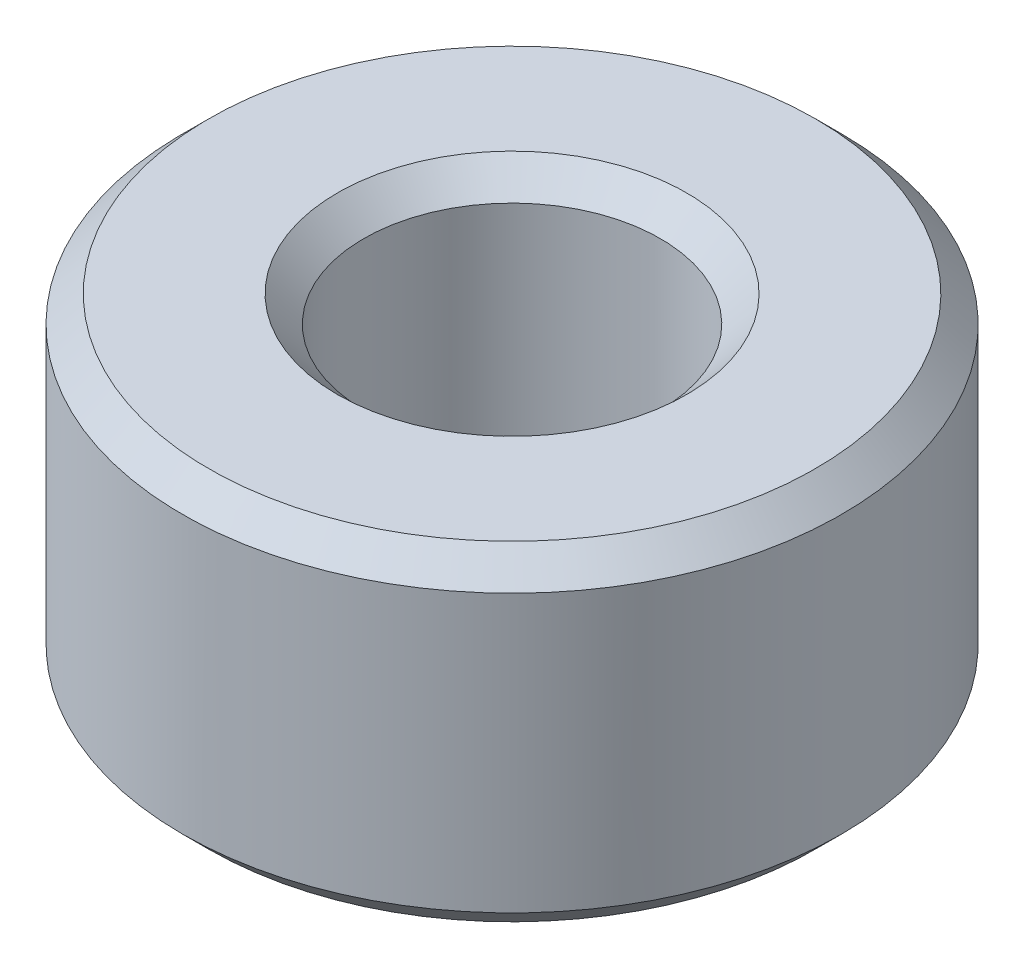
ISO-10303-21;
HEADER;
FILE_DESCRIPTION(('STEP AP214'),'2;1');
FILE_NAME('part.step','',(''),(''),'','','');
FILE_SCHEMA(('AUTOMOTIVE_DESIGN { 1 0 10303 214 1 1 1 1 }'));
ENDSEC;
DATA;
#1=APPLICATION_CONTEXT('core data for automotive mechanical design processes');
#2=APPLICATION_PROTOCOL_DEFINITION('international standard','automotive_design',2000,#1);
#3=PRODUCT_CONTEXT('',#1,'mechanical');
#4=PRODUCT('Part','Part','',(#3));
#5=PRODUCT_RELATED_PRODUCT_CATEGORY('part','',(#4));
#6=PRODUCT_DEFINITION_FORMATION('','',#4);
#7=PRODUCT_DEFINITION_CONTEXT('part definition',#1,'design');
#8=PRODUCT_DEFINITION('design','',#6,#7);
#9=PRODUCT_DEFINITION_SHAPE('','',#8);
#10=(LENGTH_UNIT() NAMED_UNIT(*) SI_UNIT(.MILLI.,.METRE.));
#11=(NAMED_UNIT(*) PLANE_ANGLE_UNIT() SI_UNIT($,.RADIAN.));
#12=(NAMED_UNIT(*) SI_UNIT($,.STERADIAN.) SOLID_ANGLE_UNIT());
#13=UNCERTAINTY_MEASURE_WITH_UNIT(LENGTH_MEASURE(1.E-05),#10,'distance_accuracy_value','');
#14=(GEOMETRIC_REPRESENTATION_CONTEXT(3) GLOBAL_UNCERTAINTY_ASSIGNED_CONTEXT((#13)) GLOBAL_UNIT_ASSIGNED_CONTEXT((#10,
#11,#12)) REPRESENTATION_CONTEXT('',''));
#15=CARTESIAN_POINT('',(0.,0.,0.));
#16=DIRECTION('',(0.,0.,1.));
#17=DIRECTION('',(1.,0.,0.));
#18=AXIS2_PLACEMENT_3D('',#15,#16,#17);
#19=CARTESIAN_POINT('',(0.,5.,0.));
#20=DIRECTION('',(0.,1.,0.));
#21=DIRECTION('',(0.,0.,1.));
#22=AXIS2_PLACEMENT_3D('',#19,#20,#21);
#23=PLANE('',#22);
#24=CARTESIAN_POINT('',(0.,5.,0.));
#25=DIRECTION('',(0.,1.,0.));
#26=DIRECTION('',(0.,0.,1.));
#27=AXIS2_PLACEMENT_3D('',#24,#25,#26);
#28=CIRCLE('',#27,4.6);
#29=CARTESIAN_POINT('',(0.,5.,-4.6));
#30=VERTEX_POINT('',#29);
#31=EDGE_CURVE('E10',#30,#30,#28,.T.);
#32=ORIENTED_EDGE('',*,*,#31,.T.);
#33=EDGE_LOOP('',(#32));
#34=FACE_BOUND('',#33,.T.);
#35=CARTESIAN_POINT('',(0.,5.,0.));
#36=DIRECTION('',(0.,1.,0.));
#37=DIRECTION('',(0.,0.,1.));
#38=AXIS2_PLACEMENT_3D('',#35,#36,#37);
#39=CIRCLE('',#38,2.65);
#40=CARTESIAN_POINT('',(0.,5.,2.65));
#41=VERTEX_POINT('',#40);
#42=EDGE_CURVE('E47',#41,#41,#39,.F.);
#43=ORIENTED_EDGE('',*,*,#42,.T.);
#44=EDGE_LOOP('',(#43));
#45=FACE_BOUND('',#44,.T.);
#46=ADVANCED_FACE('F39',(#34,#45),#23,.T.);
#47=CARTESIAN_POINT('',(0.,0.,0.));
#48=DIRECTION('',(0.,1.,0.));
#49=DIRECTION('',(0.,0.,1.));
#50=AXIS2_PLACEMENT_3D('',#47,#48,#49);
#51=PLANE('',#50);
#52=CARTESIAN_POINT('',(0.,0.,0.));
#53=DIRECTION('',(0.,1.,0.));
#54=DIRECTION('',(0.,0.,1.));
#55=AXIS2_PLACEMENT_3D('',#52,#53,#54);
#56=CIRCLE('',#55,4.6);
#57=CARTESIAN_POINT('',(0.,0.,4.6));
#58=VERTEX_POINT('',#57);
#59=EDGE_CURVE('E60',#58,#58,#56,.F.);
#60=ORIENTED_EDGE('',*,*,#59,.T.);
#61=EDGE_LOOP('',(#60));
#62=FACE_BOUND('',#61,.T.);
#63=CARTESIAN_POINT('',(0.,0.,0.));
#64=DIRECTION('',(0.,1.,0.));
#65=DIRECTION('',(0.,0.,1.));
#66=AXIS2_PLACEMENT_3D('',#63,#64,#65);
#67=CIRCLE('',#66,2.65);
#68=CARTESIAN_POINT('',(0.,0.,2.65));
#69=VERTEX_POINT('',#68);
#70=EDGE_CURVE('E63',#69,#69,#67,.T.);
#71=ORIENTED_EDGE('',*,*,#70,.T.);
#72=EDGE_LOOP('',(#71));
#73=FACE_BOUND('',#72,.T.);
#74=ADVANCED_FACE('F89',(#62,#73),#51,.F.);
#75=CARTESIAN_POINT('',(0.,5.,0.));
#76=DIRECTION('',(0.,-1.,0.));
#77=DIRECTION('',(0.,0.,-1.));
#78=AXIS2_PLACEMENT_3D('',#75,#76,#77);
#79=CYLINDRICAL_SURFACE('',#78,5.);
#80=CARTESIAN_POINT('',(0.,0.400000000000002,0.));
#81=DIRECTION('',(0.,1.,0.));
#82=DIRECTION('',(0.,0.,1.));
#83=AXIS2_PLACEMENT_3D('',#80,#81,#82);
#84=CIRCLE('',#83,5.);
#85=CARTESIAN_POINT('',(0.,0.400000000000002,5.));
#86=VERTEX_POINT('',#85);
#87=EDGE_CURVE('E66',#86,#86,#84,.T.);
#88=ORIENTED_EDGE('',*,*,#87,.T.);
#89=EDGE_LOOP('',(#88));
#90=FACE_BOUND('',#89,.T.);
#91=CARTESIAN_POINT('',(0.,4.6,0.));
#92=DIRECTION('',(0.,1.,0.));
#93=DIRECTION('',(0.,0.,1.));
#94=AXIS2_PLACEMENT_3D('',#91,#92,#93);
#95=CIRCLE('',#94,5.);
#96=CARTESIAN_POINT('',(0.,4.6,-5.));
#97=VERTEX_POINT('',#96);
#98=EDGE_CURVE('E69',#97,#97,#95,.F.);
#99=ORIENTED_EDGE('',*,*,#98,.T.);
#100=EDGE_LOOP('',(#99));
#101=FACE_BOUND('',#100,.T.);
#102=ADVANCED_FACE('F73',(#90,#101),#79,.T.);
#103=CARTESIAN_POINT('',(0.,5.,0.));
#104=DIRECTION('',(0.,-1.,0.));
#105=DIRECTION('',(0.,0.,-1.));
#106=AXIS2_PLACEMENT_3D('',#103,#104,#105);
#107=CYLINDRICAL_SURFACE('',#106,2.25);
#108=CARTESIAN_POINT('',(0.,0.400000000000002,0.));
#109=DIRECTION('',(0.,1.,0.));
#110=DIRECTION('',(0.,0.,1.));
#111=AXIS2_PLACEMENT_3D('',#108,#109,#110);
#112=CIRCLE('',#111,2.25);
#113=CARTESIAN_POINT('',(0.,0.400000000000002,2.25));
#114=VERTEX_POINT('',#113);
#115=EDGE_CURVE('E51',#114,#114,#112,.F.);
#116=ORIENTED_EDGE('',*,*,#115,.T.);
#117=EDGE_LOOP('',(#116));
#118=FACE_BOUND('',#117,.T.);
#119=CARTESIAN_POINT('',(0.,4.6,0.));
#120=DIRECTION('',(0.,1.,0.));
#121=DIRECTION('',(0.,0.,1.));
#122=AXIS2_PLACEMENT_3D('',#119,#120,#121);
#123=CIRCLE('',#122,2.25);
#124=CARTESIAN_POINT('',(0.,4.6,2.25));
#125=VERTEX_POINT('',#124);
#126=EDGE_CURVE('E55',#125,#125,#123,.T.);
#127=ORIENTED_EDGE('',*,*,#126,.T.);
#128=EDGE_LOOP('',(#127));
#129=FACE_BOUND('',#128,.T.);
#130=ADVANCED_FACE('F97',(#118,#129),#107,.F.);
#131=CARTESIAN_POINT('',(0.,0.400000000000002,0.));
#132=DIRECTION('',(0.,1.,0.));
#133=DIRECTION('',(0.,0.,1.));
#134=AXIS2_PLACEMENT_3D('',#131,#132,#133);
#135=CONICAL_SURFACE('',#134,5.,0.78539816339745);
#136=ORIENTED_EDGE('',*,*,#59,.F.);
#137=EDGE_LOOP('',(#136));
#138=FACE_BOUND('',#137,.T.);
#139=ORIENTED_EDGE('',*,*,#87,.F.);
#140=EDGE_LOOP('',(#139));
#141=FACE_BOUND('',#140,.T.);
#142=ADVANCED_FACE('F84',(#138,#141),#135,.T.);
#143=CARTESIAN_POINT('',(0.,0.,0.));
#144=DIRECTION('',(0.,-1.,0.));
#145=DIRECTION('',(0.,0.,-1.));
#146=AXIS2_PLACEMENT_3D('',#143,#144,#145);
#147=CONICAL_SURFACE('',#146,2.65,0.785398163397448);
#148=ORIENTED_EDGE('',*,*,#115,.F.);
#149=EDGE_LOOP('',(#148));
#150=FACE_BOUND('',#149,.T.);
#151=ORIENTED_EDGE('',*,*,#70,.F.);
#152=EDGE_LOOP('',(#151));
#153=FACE_BOUND('',#152,.T.);
#154=ADVANCED_FACE('F78',(#150,#153),#147,.F.);
#155=CARTESIAN_POINT('',(0.,5.,0.));
#156=DIRECTION('',(0.,-1.,0.));
#157=DIRECTION('',(0.,0.,-1.));
#158=AXIS2_PLACEMENT_3D('',#155,#156,#157);
#159=CONICAL_SURFACE('',#158,4.6,0.785398163397445);
#160=CARTESIAN_POINT('',(0.,4.6,-5.));
#161=CARTESIAN_POINT('',(0.,4.60416666666667,-4.99583333333333));
#162=CARTESIAN_POINT('',(0.,4.60833333333333,-4.99166666666667));
#163=CARTESIAN_POINT('',(0.,4.61666666666667,-4.98333333333333));
#164=CARTESIAN_POINT('',(0.,4.62083333333333,-4.97916666666667));
#165=CARTESIAN_POINT('',(0.,4.62916666666667,-4.97083333333333));
#166=CARTESIAN_POINT('',(0.,4.63333333333333,-4.96666666666667));
#167=CARTESIAN_POINT('',(0.,4.64166666666667,-4.95833333333333));
#168=CARTESIAN_POINT('',(0.,4.64583333333333,-4.95416666666667));
#169=CARTESIAN_POINT('',(0.,4.65416666666667,-4.94583333333333));
#170=CARTESIAN_POINT('',(0.,4.65833333333333,-4.94166666666667));
#171=CARTESIAN_POINT('',(0.,4.66666666666667,-4.93333333333333));
#172=CARTESIAN_POINT('',(0.,4.67083333333333,-4.92916666666667));
#173=CARTESIAN_POINT('',(0.,4.67916666666667,-4.92083333333333));
#174=CARTESIAN_POINT('',(0.,4.68333333333333,-4.91666666666667));
#175=CARTESIAN_POINT('',(0.,4.69166666666667,-4.90833333333333));
#176=CARTESIAN_POINT('',(0.,4.69583333333333,-4.90416666666667));
#177=CARTESIAN_POINT('',(0.,4.70416666666667,-4.89583333333333));
#178=CARTESIAN_POINT('',(0.,4.70833333333333,-4.89166666666667));
#179=CARTESIAN_POINT('',(0.,4.71666666666667,-4.88333333333333));
#180=CARTESIAN_POINT('',(0.,4.72083333333333,-4.87916666666667));
#181=CARTESIAN_POINT('',(0.,4.72916666666667,-4.87083333333333));
#182=CARTESIAN_POINT('',(0.,4.73333333333333,-4.86666666666667));
#183=CARTESIAN_POINT('',(0.,4.74166666666667,-4.85833333333334));
#184=CARTESIAN_POINT('',(0.,4.74583333333333,-4.85416666666667));
#185=CARTESIAN_POINT('',(0.,4.75416666666667,-4.84583333333333));
#186=CARTESIAN_POINT('',(0.,4.75833333333333,-4.84166666666667));
#187=CARTESIAN_POINT('',(0.,4.76666666666667,-4.83333333333334));
#188=CARTESIAN_POINT('',(0.,4.77083333333333,-4.82916666666667));
#189=CARTESIAN_POINT('',(0.,4.77916666666667,-4.82083333333334));
#190=CARTESIAN_POINT('',(0.,4.78333333333333,-4.81666666666667));
#191=CARTESIAN_POINT('',(0.,4.79166666666667,-4.80833333333334));
#192=CARTESIAN_POINT('',(0.,4.79583333333333,-4.80416666666667));
#193=CARTESIAN_POINT('',(0.,4.80416666666667,-4.79583333333334));
#194=CARTESIAN_POINT('',(0.,4.80833333333333,-4.79166666666667));
#195=CARTESIAN_POINT('',(0.,4.81666666666667,-4.78333333333334));
#196=CARTESIAN_POINT('',(0.,4.82083333333333,-4.77916666666667));
#197=CARTESIAN_POINT('',(0.,4.82916666666667,-4.77083333333334));
#198=CARTESIAN_POINT('',(0.,4.83333333333333,-4.76666666666667));
#199=CARTESIAN_POINT('',(0.,4.84166666666667,-4.75833333333334));
#200=CARTESIAN_POINT('',(0.,4.84583333333333,-4.75416666666667));
#201=CARTESIAN_POINT('',(0.,4.85416666666667,-4.74583333333334));
#202=CARTESIAN_POINT('',(0.,4.85833333333333,-4.74166666666667));
#203=CARTESIAN_POINT('',(0.,4.86666666666667,-4.73333333333334));
#204=CARTESIAN_POINT('',(0.,4.87083333333333,-4.72916666666667));
#205=CARTESIAN_POINT('',(0.,4.87916666666667,-4.72083333333334));
#206=CARTESIAN_POINT('',(0.,4.88333333333333,-4.71666666666667));
#207=CARTESIAN_POINT('',(0.,4.89166666666667,-4.70833333333334));
#208=CARTESIAN_POINT('',(0.,4.89583333333333,-4.70416666666667));
#209=CARTESIAN_POINT('',(0.,4.90416666666667,-4.69583333333334));
#210=CARTESIAN_POINT('',(0.,4.90833333333333,-4.69166666666667));
#211=CARTESIAN_POINT('',(0.,4.91666666666667,-4.68333333333334));
#212=CARTESIAN_POINT('',(0.,4.92083333333333,-4.67916666666667));
#213=CARTESIAN_POINT('',(0.,4.92916666666667,-4.67083333333334));
#214=CARTESIAN_POINT('',(0.,4.93333333333333,-4.66666666666667));
#215=CARTESIAN_POINT('',(0.,4.94166666666667,-4.65833333333334));
#216=CARTESIAN_POINT('',(0.,4.94583333333333,-4.65416666666667));
#217=CARTESIAN_POINT('',(0.,4.95416666666667,-4.64583333333334));
#218=CARTESIAN_POINT('',(0.,4.95833333333333,-4.64166666666667));
#219=CARTESIAN_POINT('',(0.,4.96666666666667,-4.63333333333334));
#220=CARTESIAN_POINT('',(0.,4.97083333333333,-4.62916666666667));
#221=CARTESIAN_POINT('',(0.,4.97916666666667,-4.62083333333334));
#222=CARTESIAN_POINT('',(0.,4.98333333333333,-4.61666666666667));
#223=CARTESIAN_POINT('',(0.,4.99166666666667,-4.60833333333334));
#224=CARTESIAN_POINT('',(0.,4.99583333333333,-4.60416666666667));
#225=CARTESIAN_POINT('',(0.,5.,-4.6));
#226=B_SPLINE_CURVE_WITH_KNOTS('',3,(#160,#161,#162,#163,#164,#165,#166,#167,#168,#169,#170,
#171,#172,#173,#174,#175,#176,#177,#178,#179,#180,#181,#182,#183,#184,#185,#186,#187,#188,#189,
#190,#191,#192,#193,#194,#195,#196,#197,#198,#199,#200,#201,#202,#203,#204,#205,#206,#207,#208,
#209,#210,#211,#212,#213,#214,#215,#216,#217,#218,#219,#220,#221,#222,#223,#224,#225),
.UNSPECIFIED.,.F.,.F.,(4,2,2,2,2,2,2,2,2,2,2,2,2,2,2,2,2,2,2,2,2,2,2,2,2,2,2,2,2,2,2,2,4),(0.,
0.0176776695296636,0.0353553390593272,0.0530330085889907,0.0707106781186543,0.0883883476483179,
0.106066017177981,0.123743686707646,0.141421356237309,0.159099025766973,0.176776695296636,
0.1944543648263,0.212132034355963,0.229809703885627,0.24748737341529,0.265165042944954,
0.282842712474618,0.300520382004281,0.318198051533945,0.335875721063608,0.353553390593272,
0.371231060122935,0.388908729652599,0.406586399182262,0.424264068711927,0.44194173824159,
0.459619407771254,0.477297077300917,0.494974746830581,0.512652416360245,0.530330085889908,
0.548007755419572,0.565685424949236),.UNSPECIFIED.);
#227=EDGE_CURVE('BSEAM75',#97,#30,#226,.T.);
#228=ORIENTED_EDGE('',*,*,#98,.F.);
#229=ORIENTED_EDGE('',*,*,#31,.F.);
#230=ORIENTED_EDGE('',*,*,#227,.T.);
#231=ORIENTED_EDGE('',*,*,#227,.F.);
#232=EDGE_LOOP('',(#228,#230,#229,#231));
#233=FACE_BOUND('',#232,.T.);
#234=ADVANCED_FACE('F75',(#233),#159,.T.);
#235=CARTESIAN_POINT('',(0.,4.6,0.));
#236=DIRECTION('',(0.,1.,0.));
#237=DIRECTION('',(0.,0.,1.));
#238=AXIS2_PLACEMENT_3D('',#235,#236,#237);
#239=CONICAL_SURFACE('',#238,2.25,0.785398163397449);
#240=ORIENTED_EDGE('',*,*,#42,.F.);
#241=EDGE_LOOP('',(#240));
#242=FACE_BOUND('',#241,.T.);
#243=ORIENTED_EDGE('',*,*,#126,.F.);
#244=EDGE_LOOP('',(#243));
#245=FACE_BOUND('',#244,.T.);
#246=ADVANCED_FACE('F42',(#242,#245),#239,.F.);
#247=CLOSED_SHELL('',(#46,#74,#102,#130,#142,#154,#234,#246));
#248=MANIFOLD_SOLID_BREP('B2',#247);
#249=ADVANCED_BREP_SHAPE_REPRESENTATION('',(#18,#248),#14);
#250=SHAPE_DEFINITION_REPRESENTATION(#9,#249);
ENDSEC;
END-ISO-10303-21;
